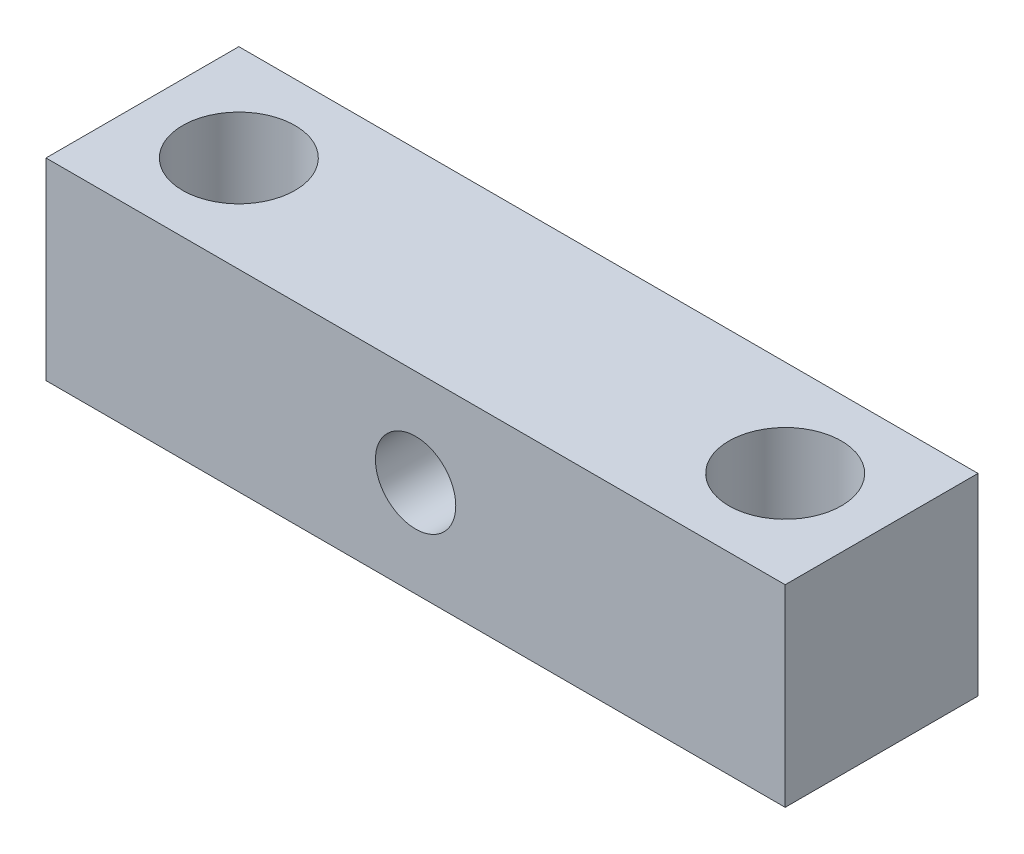
ISO-10303-21;
HEADER;
FILE_DESCRIPTION(('STEP AP214'),'2;1');
FILE_NAME('part.step','',(''),(''),'','','');
FILE_SCHEMA(('AUTOMOTIVE_DESIGN { 1 0 10303 214 1 1 1 1 }'));
ENDSEC;
DATA;
#1=APPLICATION_CONTEXT('core data for automotive mechanical design processes');
#2=APPLICATION_PROTOCOL_DEFINITION('international standard','automotive_design',2000,#1);
#3=PRODUCT_CONTEXT('',#1,'mechanical');
#4=PRODUCT('Part','Part','',(#3));
#5=PRODUCT_RELATED_PRODUCT_CATEGORY('part','',(#4));
#6=PRODUCT_DEFINITION_FORMATION('','',#4);
#7=PRODUCT_DEFINITION_CONTEXT('part definition',#1,'design');
#8=PRODUCT_DEFINITION('design','',#6,#7);
#9=PRODUCT_DEFINITION_SHAPE('','',#8);
#10=(LENGTH_UNIT() NAMED_UNIT(*) SI_UNIT(.MILLI.,.METRE.));
#11=(NAMED_UNIT(*) PLANE_ANGLE_UNIT() SI_UNIT($,.RADIAN.));
#12=(NAMED_UNIT(*) SI_UNIT($,.STERADIAN.) SOLID_ANGLE_UNIT());
#13=UNCERTAINTY_MEASURE_WITH_UNIT(LENGTH_MEASURE(1.E-05),#10,'distance_accuracy_value','');
#14=(GEOMETRIC_REPRESENTATION_CONTEXT(3) GLOBAL_UNCERTAINTY_ASSIGNED_CONTEXT((#13)) GLOBAL_UNIT_ASSIGNED_CONTEXT((#10,
#11,#12)) REPRESENTATION_CONTEXT('',''));
#15=CARTESIAN_POINT('',(0.,0.,0.));
#16=DIRECTION('',(0.,0.,1.));
#17=DIRECTION('',(1.,0.,0.));
#18=AXIS2_PLACEMENT_3D('',#15,#16,#17);
#19=CARTESIAN_POINT('',(-23.,12.,0.));
#20=DIRECTION('',(0.,0.,-1.));
#21=DIRECTION('',(-1.,0.,0.));
#22=AXIS2_PLACEMENT_3D('',#19,#20,#21);
#23=PLANE('',#22);
#24=DIRECTION('',(1.,0.,0.));
#25=VECTOR('',#24,1.);
#26=CARTESIAN_POINT('',(-23.,0.,0.));
#27=LINE('',#26,#25);
#28=CARTESIAN_POINT('',(-23.,0.,0.));
#29=VERTEX_POINT('',#28);
#30=CARTESIAN_POINT('',(23.,0.,0.));
#31=VERTEX_POINT('',#30);
#32=EDGE_CURVE('E90',#29,#31,#27,.T.);
#33=ORIENTED_EDGE('',*,*,#32,.T.);
#34=DIRECTION('',(0.,-1.,0.));
#35=VECTOR('',#34,1.);
#36=CARTESIAN_POINT('',(23.,12.,0.));
#37=LINE('',#36,#35);
#38=CARTESIAN_POINT('',(23.,12.,0.));
#39=VERTEX_POINT('',#38);
#40=EDGE_CURVE('E43',#39,#31,#37,.T.);
#41=ORIENTED_EDGE('',*,*,#40,.F.);
#42=DIRECTION('',(1.,0.,0.));
#43=VECTOR('',#42,1.);
#44=CARTESIAN_POINT('',(-23.,12.,0.));
#45=LINE('',#44,#43);
#46=CARTESIAN_POINT('',(-23.,12.,0.));
#47=VERTEX_POINT('',#46);
#48=EDGE_CURVE('E81',#47,#39,#45,.T.);
#49=ORIENTED_EDGE('',*,*,#48,.F.);
#50=DIRECTION('',(0.,-1.,0.));
#51=VECTOR('',#50,1.);
#52=CARTESIAN_POINT('',(-23.,12.,0.));
#53=LINE('',#52,#51);
#54=EDGE_CURVE('E11',#47,#29,#53,.T.);
#55=ORIENTED_EDGE('',*,*,#54,.T.);
#56=EDGE_LOOP('',(#33,#41,#49,#55));
#57=FACE_BOUND('',#56,.T.);
#58=CARTESIAN_POINT('',(0.,6.,0.));
#59=DIRECTION('',(0.,0.,1.));
#60=DIRECTION('',(1.,0.,0.));
#61=AXIS2_PLACEMENT_3D('',#58,#59,#60);
#62=CIRCLE('',#61,2.5);
#63=CARTESIAN_POINT('',(2.5,6.,0.));
#64=VERTEX_POINT('',#63);
#65=EDGE_CURVE('E126',#64,#64,#62,.T.);
#66=ORIENTED_EDGE('',*,*,#65,.F.);
#67=EDGE_LOOP('',(#66));
#68=FACE_BOUND('',#67,.T.);
#69=ADVANCED_FACE('F34',(#57,#68),#23,.F.);
#70=CARTESIAN_POINT('',(-23.,12.,-12.));
#71=DIRECTION('',(1.,0.,0.));
#72=DIRECTION('',(0.,0.,-1.));
#73=AXIS2_PLACEMENT_3D('',#70,#71,#72);
#74=PLANE('',#73);
#75=DIRECTION('',(0.,0.,1.));
#76=VECTOR('',#75,1.);
#77=CARTESIAN_POINT('',(-23.,0.,-12.));
#78=LINE('',#77,#76);
#79=CARTESIAN_POINT('',(-23.,0.,-12.));
#80=VERTEX_POINT('',#79);
#81=EDGE_CURVE('E98',#80,#29,#78,.T.);
#82=ORIENTED_EDGE('',*,*,#81,.T.);
#83=ORIENTED_EDGE('',*,*,#54,.F.);
#84=DIRECTION('',(0.,0.,1.));
#85=VECTOR('',#84,1.);
#86=CARTESIAN_POINT('',(-23.,12.,-12.));
#87=LINE('',#86,#85);
#88=CARTESIAN_POINT('',(-23.,12.,-12.));
#89=VERTEX_POINT('',#88);
#90=EDGE_CURVE('E86',#89,#47,#87,.T.);
#91=ORIENTED_EDGE('',*,*,#90,.F.);
#92=DIRECTION('',(0.,-1.,0.));
#93=VECTOR('',#92,1.);
#94=CARTESIAN_POINT('',(-23.,12.,-12.));
#95=LINE('',#94,#93);
#96=EDGE_CURVE('E94',#89,#80,#95,.T.);
#97=ORIENTED_EDGE('',*,*,#96,.T.);
#98=EDGE_LOOP('',(#82,#83,#91,#97));
#99=FACE_BOUND('',#98,.T.);
#100=ADVANCED_FACE('F36',(#99),#74,.F.);
#101=CARTESIAN_POINT('',(23.,12.,-12.));
#102=DIRECTION('',(-1.,0.,0.));
#103=DIRECTION('',(0.,0.,1.));
#104=AXIS2_PLACEMENT_3D('',#101,#102,#103);
#105=PLANE('',#104);
#106=DIRECTION('',(0.,0.,-1.));
#107=VECTOR('',#106,1.);
#108=CARTESIAN_POINT('',(23.,0.,-12.));
#109=LINE('',#108,#107);
#110=CARTESIAN_POINT('',(23.,0.,-12.));
#111=VERTEX_POINT('',#110);
#112=EDGE_CURVE('E68',#31,#111,#109,.T.);
#113=ORIENTED_EDGE('',*,*,#112,.T.);
#114=DIRECTION('',(0.,-1.,0.));
#115=VECTOR('',#114,1.);
#116=CARTESIAN_POINT('',(23.,12.,-12.));
#117=LINE('',#116,#115);
#118=CARTESIAN_POINT('',(23.,12.,-12.));
#119=VERTEX_POINT('',#118);
#120=EDGE_CURVE('E91',#119,#111,#117,.T.);
#121=ORIENTED_EDGE('',*,*,#120,.F.);
#122=DIRECTION('',(0.,0.,-1.));
#123=VECTOR('',#122,1.);
#124=CARTESIAN_POINT('',(23.,12.,-12.));
#125=LINE('',#124,#123);
#126=EDGE_CURVE('E84',#39,#119,#125,.T.);
#127=ORIENTED_EDGE('',*,*,#126,.F.);
#128=ORIENTED_EDGE('',*,*,#40,.T.);
#129=EDGE_LOOP('',(#113,#121,#127,#128));
#130=FACE_BOUND('',#129,.T.);
#131=ADVANCED_FACE('F92',(#130),#105,.F.);
#132=CARTESIAN_POINT('',(-23.,12.,-12.));
#133=DIRECTION('',(0.,0.,1.));
#134=DIRECTION('',(1.,0.,0.));
#135=AXIS2_PLACEMENT_3D('',#132,#133,#134);
#136=PLANE('',#135);
#137=CARTESIAN_POINT('',(0.,6.,-12.));
#138=DIRECTION('',(0.,0.,1.));
#139=DIRECTION('',(1.,0.,0.));
#140=AXIS2_PLACEMENT_3D('',#137,#138,#139);
#141=CIRCLE('',#140,2.5);
#142=CARTESIAN_POINT('',(2.5,6.,-12.));
#143=VERTEX_POINT('',#142);
#144=EDGE_CURVE('E123',#143,#143,#141,.T.);
#145=ORIENTED_EDGE('',*,*,#144,.T.);
#146=EDGE_LOOP('',(#145));
#147=FACE_BOUND('',#146,.T.);
#148=DIRECTION('',(-1.,0.,0.));
#149=VECTOR('',#148,1.);
#150=CARTESIAN_POINT('',(-23.,0.,-12.));
#151=LINE('',#150,#149);
#152=EDGE_CURVE('E74',#111,#80,#151,.T.);
#153=ORIENTED_EDGE('',*,*,#152,.T.);
#154=ORIENTED_EDGE('',*,*,#96,.F.);
#155=DIRECTION('',(-1.,0.,0.));
#156=VECTOR('',#155,1.);
#157=CARTESIAN_POINT('',(-23.,12.,-12.));
#158=LINE('',#157,#156);
#159=EDGE_CURVE('E51',#119,#89,#158,.T.);
#160=ORIENTED_EDGE('',*,*,#159,.F.);
#161=ORIENTED_EDGE('',*,*,#120,.T.);
#162=EDGE_LOOP('',(#153,#154,#160,#161));
#163=FACE_BOUND('',#162,.T.);
#164=ADVANCED_FACE('F106',(#147,#163),#136,.F.);
#165=CARTESIAN_POINT('',(-23.,12.,0.));
#166=DIRECTION('',(0.,1.,0.));
#167=DIRECTION('',(0.,0.,1.));
#168=AXIS2_PLACEMENT_3D('',#165,#166,#167);
#169=PLANE('',#168);
#170=CARTESIAN_POINT('',(17.,12.,-6.));
#171=DIRECTION('',(0.,1.,0.));
#172=DIRECTION('',(0.,0.,1.));
#173=AXIS2_PLACEMENT_3D('',#170,#171,#172);
#174=CIRCLE('',#173,3.49999999999999);
#175=CARTESIAN_POINT('',(17.,12.,-2.50000000000001));
#176=VERTEX_POINT('',#175);
#177=EDGE_CURVE('E120',#176,#176,#174,.T.);
#178=ORIENTED_EDGE('',*,*,#177,.F.);
#179=EDGE_LOOP('',(#178));
#180=FACE_BOUND('',#179,.T.);
#181=CARTESIAN_POINT('',(-17.,12.,-6.));
#182=DIRECTION('',(0.,1.,0.));
#183=DIRECTION('',(0.,0.,1.));
#184=AXIS2_PLACEMENT_3D('',#181,#182,#183);
#185=CIRCLE('',#184,3.49999999999999);
#186=CARTESIAN_POINT('',(-17.,12.,-2.50000000000001));
#187=VERTEX_POINT('',#186);
#188=EDGE_CURVE('E114',#187,#187,#185,.T.);
#189=ORIENTED_EDGE('',*,*,#188,.F.);
#190=EDGE_LOOP('',(#189));
#191=FACE_BOUND('',#190,.T.);
#192=ORIENTED_EDGE('',*,*,#90,.T.);
#193=ORIENTED_EDGE('',*,*,#48,.T.);
#194=ORIENTED_EDGE('',*,*,#126,.T.);
#195=ORIENTED_EDGE('',*,*,#159,.T.);
#196=EDGE_LOOP('',(#192,#193,#194,#195));
#197=FACE_BOUND('',#196,.T.);
#198=ADVANCED_FACE('F82',(#180,#191,#197),#169,.T.);
#199=CARTESIAN_POINT('',(-23.,0.,0.));
#200=DIRECTION('',(0.,1.,0.));
#201=DIRECTION('',(0.,0.,1.));
#202=AXIS2_PLACEMENT_3D('',#199,#200,#201);
#203=PLANE('',#202);
#204=CARTESIAN_POINT('',(17.,0.,-6.));
#205=DIRECTION('',(0.,1.,0.));
#206=DIRECTION('',(0.,0.,1.));
#207=AXIS2_PLACEMENT_3D('',#204,#205,#206);
#208=CIRCLE('',#207,3.49999999999999);
#209=CARTESIAN_POINT('',(17.,0.,-2.50000000000001));
#210=VERTEX_POINT('',#209);
#211=EDGE_CURVE('E117',#210,#210,#208,.T.);
#212=ORIENTED_EDGE('',*,*,#211,.T.);
#213=EDGE_LOOP('',(#212));
#214=FACE_BOUND('',#213,.T.);
#215=CARTESIAN_POINT('',(-17.,0.,-6.));
#216=DIRECTION('',(0.,1.,0.));
#217=DIRECTION('',(0.,0.,1.));
#218=AXIS2_PLACEMENT_3D('',#215,#216,#217);
#219=CIRCLE('',#218,3.49999999999999);
#220=CARTESIAN_POINT('',(-17.,0.,-2.50000000000001));
#221=VERTEX_POINT('',#220);
#222=EDGE_CURVE('E101',#221,#221,#219,.T.);
#223=ORIENTED_EDGE('',*,*,#222,.T.);
#224=EDGE_LOOP('',(#223));
#225=FACE_BOUND('',#224,.T.);
#226=ORIENTED_EDGE('',*,*,#81,.F.);
#227=ORIENTED_EDGE('',*,*,#152,.F.);
#228=ORIENTED_EDGE('',*,*,#112,.F.);
#229=ORIENTED_EDGE('',*,*,#32,.F.);
#230=EDGE_LOOP('',(#226,#227,#228,#229));
#231=FACE_BOUND('',#230,.T.);
#232=ADVANCED_FACE('F109',(#214,#225,#231),#203,.F.);
#233=CARTESIAN_POINT('',(-17.,12.,-6.));
#234=DIRECTION('',(0.,1.,0.));
#235=DIRECTION('',(0.,0.,1.));
#236=AXIS2_PLACEMENT_3D('',#233,#234,#235);
#237=CYLINDRICAL_SURFACE('',#236,3.49999999999999);
#238=ORIENTED_EDGE('',*,*,#222,.F.);
#239=EDGE_LOOP('',(#238));
#240=FACE_BOUND('',#239,.T.);
#241=ORIENTED_EDGE('',*,*,#188,.T.);
#242=EDGE_LOOP('',(#241));
#243=FACE_BOUND('',#242,.T.);
#244=ADVANCED_FACE('F143',(#240,#243),#237,.F.);
#245=CARTESIAN_POINT('',(17.,12.,-6.));
#246=DIRECTION('',(0.,1.,0.));
#247=DIRECTION('',(0.,0.,1.));
#248=AXIS2_PLACEMENT_3D('',#245,#246,#247);
#249=CYLINDRICAL_SURFACE('',#248,3.49999999999999);
#250=ORIENTED_EDGE('',*,*,#211,.F.);
#251=EDGE_LOOP('',(#250));
#252=FACE_BOUND('',#251,.T.);
#253=ORIENTED_EDGE('',*,*,#177,.T.);
#254=EDGE_LOOP('',(#253));
#255=FACE_BOUND('',#254,.T.);
#256=ADVANCED_FACE('F150',(#252,#255),#249,.F.);
#257=CARTESIAN_POINT('',(0.,6.,0.));
#258=DIRECTION('',(0.,0.,1.));
#259=DIRECTION('',(1.,0.,0.));
#260=AXIS2_PLACEMENT_3D('',#257,#258,#259);
#261=CYLINDRICAL_SURFACE('',#260,2.5);
#262=ORIENTED_EDGE('',*,*,#144,.F.);
#263=EDGE_LOOP('',(#262));
#264=FACE_BOUND('',#263,.T.);
#265=ORIENTED_EDGE('',*,*,#65,.T.);
#266=EDGE_LOOP('',(#265));
#267=FACE_BOUND('',#266,.T.);
#268=ADVANCED_FACE('F130',(#264,#267),#261,.F.);
#269=CLOSED_SHELL('',(#69,#100,#131,#164,#198,#232,#244,#256,#268));
#270=MANIFOLD_SOLID_BREP('B2',#269);
#271=ADVANCED_BREP_SHAPE_REPRESENTATION('',(#18,#270),#14);
#272=SHAPE_DEFINITION_REPRESENTATION(#9,#271);
ENDSEC;
END-ISO-10303-21;
